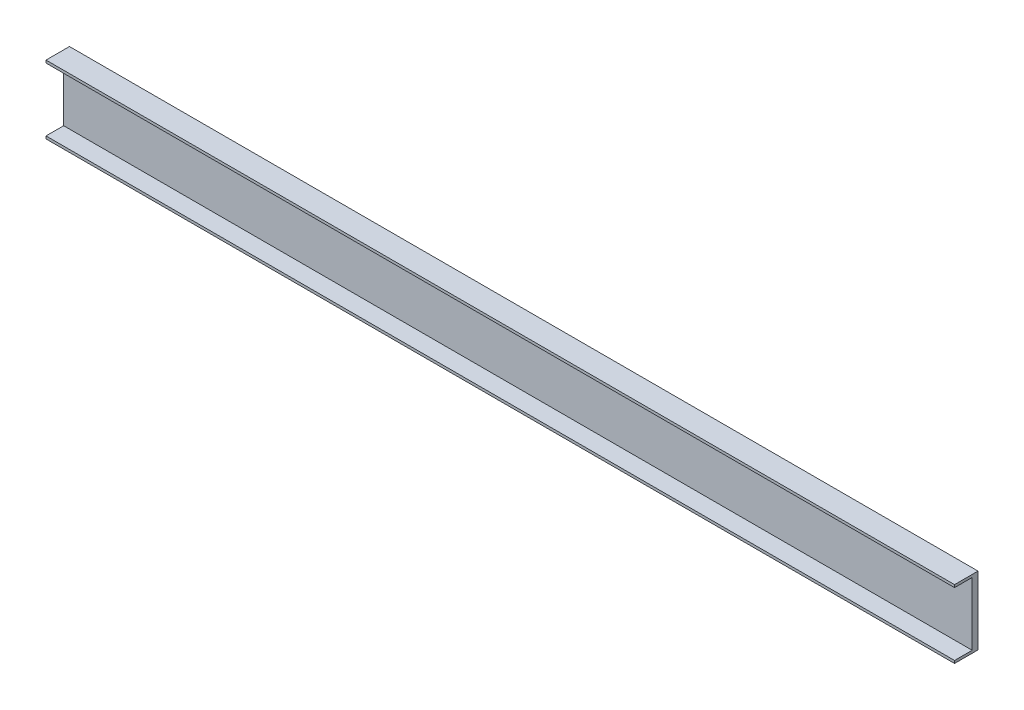
ISO-10303-21;
HEADER;
FILE_DESCRIPTION(('STEP AP214'),'2;1');
FILE_NAME('part.step','',(''),(''),'','','');
FILE_SCHEMA(('AUTOMOTIVE_DESIGN { 1 0 10303 214 1 1 1 1 }'));
ENDSEC;
DATA;
#1=APPLICATION_CONTEXT('core data for automotive mechanical design processes');
#2=APPLICATION_PROTOCOL_DEFINITION('international standard','automotive_design',2000,#1);
#3=PRODUCT_CONTEXT('',#1,'mechanical');
#4=PRODUCT('Part','Part','',(#3));
#5=PRODUCT_RELATED_PRODUCT_CATEGORY('part','',(#4));
#6=PRODUCT_DEFINITION_FORMATION('','',#4);
#7=PRODUCT_DEFINITION_CONTEXT('part definition',#1,'design');
#8=PRODUCT_DEFINITION('design','',#6,#7);
#9=PRODUCT_DEFINITION_SHAPE('','',#8);
#10=(LENGTH_UNIT() NAMED_UNIT(*) SI_UNIT(.MILLI.,.METRE.));
#11=(NAMED_UNIT(*) PLANE_ANGLE_UNIT() SI_UNIT($,.RADIAN.));
#12=(NAMED_UNIT(*) SI_UNIT($,.STERADIAN.) SOLID_ANGLE_UNIT());
#13=UNCERTAINTY_MEASURE_WITH_UNIT(LENGTH_MEASURE(1.E-05),#10,'distance_accuracy_value','');
#14=(GEOMETRIC_REPRESENTATION_CONTEXT(3) GLOBAL_UNCERTAINTY_ASSIGNED_CONTEXT((#13)) GLOBAL_UNIT_ASSIGNED_CONTEXT((#10,
#11,#12)) REPRESENTATION_CONTEXT('',''));
#15=CARTESIAN_POINT('',(0.,0.,0.));
#16=DIRECTION('',(0.,0.,1.));
#17=DIRECTION('',(1.,0.,0.));
#18=AXIS2_PLACEMENT_3D('',#15,#16,#17);
#19=CARTESIAN_POINT('',(-1995.,-150.,0.));
#20=DIRECTION('',(0.,0.,1.));
#21=DIRECTION('',(1.,0.,0.));
#22=AXIS2_PLACEMENT_3D('',#19,#20,#21);
#23=PLANE('',#22);
#24=DIRECTION('',(0.,1.,0.));
#25=VECTOR('',#24,1.);
#26=CARTESIAN_POINT('',(865.,115.,0.));
#27=LINE('',#26,#25);
#28=CARTESIAN_POINT('',(865.,-115.,0.));
#29=VERTEX_POINT('',#28);
#30=CARTESIAN_POINT('',(865.,115.,0.));
#31=VERTEX_POINT('',#30);
#32=EDGE_CURVE('E265',#29,#31,#27,.T.);
#33=ORIENTED_EDGE('',*,*,#32,.F.);
#34=DIRECTION('',(-1.,0.,0.));
#35=VECTOR('',#34,1.);
#36=CARTESIAN_POINT('',(865.,-115.,0.));
#37=LINE('',#36,#35);
#38=CARTESIAN_POINT('',(935.,-115.,0.));
#39=VERTEX_POINT('',#38);
#40=EDGE_CURVE('E278',#39,#29,#37,.T.);
#41=ORIENTED_EDGE('',*,*,#40,.F.);
#42=DIRECTION('',(0.,-1.,0.));
#43=VECTOR('',#42,1.);
#44=CARTESIAN_POINT('',(935.,115.,0.));
#45=LINE('',#44,#43);
#46=CARTESIAN_POINT('',(935.,115.,0.));
#47=VERTEX_POINT('',#46);
#48=EDGE_CURVE('E287',#47,#39,#45,.T.);
#49=ORIENTED_EDGE('',*,*,#48,.F.);
#50=DIRECTION('',(1.,0.,0.));
#51=VECTOR('',#50,1.);
#52=CARTESIAN_POINT('',(865.,115.,0.));
#53=LINE('',#52,#51);
#54=EDGE_CURVE('E268',#31,#47,#53,.T.);
#55=ORIENTED_EDGE('',*,*,#54,.F.);
#56=EDGE_LOOP('',(#33,#41,#49,#55));
#57=FACE_BOUND('',#56,.T.);
#58=DIRECTION('',(0.,1.,0.));
#59=VECTOR('',#58,1.);
#60=CARTESIAN_POINT('',(-535.,-115.,0.));
#61=LINE('',#60,#59);
#62=CARTESIAN_POINT('',(-535.,-115.,0.));
#63=VERTEX_POINT('',#62);
#64=CARTESIAN_POINT('',(-535.,115.,0.));
#65=VERTEX_POINT('',#64);
#66=EDGE_CURVE('E336',#63,#65,#61,.T.);
#67=ORIENTED_EDGE('',*,*,#66,.F.);
#68=DIRECTION('',(-1.,0.,0.));
#69=VECTOR('',#68,1.);
#70=CARTESIAN_POINT('',(-535.,-115.,0.));
#71=LINE('',#70,#69);
#72=CARTESIAN_POINT('',(-465.,-115.,0.));
#73=VERTEX_POINT('',#72);
#74=EDGE_CURVE('E341',#73,#63,#71,.T.);
#75=ORIENTED_EDGE('',*,*,#74,.F.);
#76=DIRECTION('',(0.,-1.,0.));
#77=VECTOR('',#76,1.);
#78=CARTESIAN_POINT('',(-465.,-115.,0.));
#79=LINE('',#78,#77);
#80=CARTESIAN_POINT('',(-465.,115.,0.));
#81=VERTEX_POINT('',#80);
#82=EDGE_CURVE('E353',#81,#73,#79,.T.);
#83=ORIENTED_EDGE('',*,*,#82,.F.);
#84=DIRECTION('',(1.,0.,0.));
#85=VECTOR('',#84,1.);
#86=CARTESIAN_POINT('',(-535.,115.,0.));
#87=LINE('',#86,#85);
#88=EDGE_CURVE('E350',#65,#81,#87,.T.);
#89=ORIENTED_EDGE('',*,*,#88,.F.);
#90=EDGE_LOOP('',(#67,#75,#83,#89));
#91=FACE_BOUND('',#90,.T.);
#92=DIRECTION('',(0.,-1.,0.));
#93=VECTOR('',#92,1.);
#94=CARTESIAN_POINT('',(-1265.,115.,0.));
#95=LINE('',#94,#93);
#96=CARTESIAN_POINT('',(-1265.,115.,0.));
#97=VERTEX_POINT('',#96);
#98=CARTESIAN_POINT('',(-1265.,-115.,0.));
#99=VERTEX_POINT('',#98);
#100=EDGE_CURVE('E402',#97,#99,#95,.T.);
#101=ORIENTED_EDGE('',*,*,#100,.F.);
#102=DIRECTION('',(1.,0.,0.));
#103=VECTOR('',#102,1.);
#104=CARTESIAN_POINT('',(-1265.,115.,0.));
#105=LINE('',#104,#103);
#106=CARTESIAN_POINT('',(-1335.,115.,0.));
#107=VERTEX_POINT('',#106);
#108=EDGE_CURVE('E407',#107,#97,#105,.T.);
#109=ORIENTED_EDGE('',*,*,#108,.F.);
#110=DIRECTION('',(0.,1.,0.));
#111=VECTOR('',#110,1.);
#112=CARTESIAN_POINT('',(-1335.,115.,0.));
#113=LINE('',#112,#111);
#114=CARTESIAN_POINT('',(-1335.,-115.,0.));
#115=VERTEX_POINT('',#114);
#116=EDGE_CURVE('E419',#115,#107,#113,.T.);
#117=ORIENTED_EDGE('',*,*,#116,.F.);
#118=DIRECTION('',(-1.,0.,0.));
#119=VECTOR('',#118,1.);
#120=CARTESIAN_POINT('',(-1265.,-115.,0.));
#121=LINE('',#120,#119);
#122=EDGE_CURVE('E416',#99,#115,#121,.T.);
#123=ORIENTED_EDGE('',*,*,#122,.F.);
#124=EDGE_LOOP('',(#101,#109,#117,#123));
#125=FACE_BOUND('',#124,.T.);
#126=DIRECTION('',(0.,-1.,0.));
#127=VECTOR('',#126,1.);
#128=CARTESIAN_POINT('',(-1995.,150.,0.));
#129=LINE('',#128,#127);
#130=CARTESIAN_POINT('',(-1995.,150.,0.));
#131=VERTEX_POINT('',#130);
#132=CARTESIAN_POINT('',(-1995.,-150.,0.));
#133=VERTEX_POINT('',#132);
#134=EDGE_CURVE('E481',#131,#133,#129,.T.);
#135=ORIENTED_EDGE('',*,*,#134,.F.);
#136=DIRECTION('',(-1.,0.,0.));
#137=VECTOR('',#136,1.);
#138=CARTESIAN_POINT('',(-1995.,150.,0.));
#139=LINE('',#138,#137);
#140=CARTESIAN_POINT('',(1995.,150.,0.));
#141=VERTEX_POINT('',#140);
#142=EDGE_CURVE('E496',#141,#131,#139,.T.);
#143=ORIENTED_EDGE('',*,*,#142,.F.);
#144=DIRECTION('',(0.,1.,0.));
#145=VECTOR('',#144,1.);
#146=CARTESIAN_POINT('',(1995.,150.,0.));
#147=LINE('',#146,#145);
#148=CARTESIAN_POINT('',(1995.,-150.,0.));
#149=VERTEX_POINT('',#148);
#150=EDGE_CURVE('E491',#149,#141,#147,.T.);
#151=ORIENTED_EDGE('',*,*,#150,.F.);
#152=DIRECTION('',(1.,0.,0.));
#153=VECTOR('',#152,1.);
#154=CARTESIAN_POINT('',(-1995.,-150.,0.));
#155=LINE('',#154,#153);
#156=EDGE_CURVE('E486',#133,#149,#155,.T.);
#157=ORIENTED_EDGE('',*,*,#156,.F.);
#158=EDGE_LOOP('',(#135,#143,#151,#157));
#159=FACE_BOUND('',#158,.T.);
#160=DIRECTION('',(0.,-1.,0.));
#161=VECTOR('',#160,1.);
#162=CARTESIAN_POINT('',(-865.,115.,0.));
#163=LINE('',#162,#161);
#164=CARTESIAN_POINT('',(-865.,115.,0.));
#165=VERTEX_POINT('',#164);
#166=CARTESIAN_POINT('',(-865.,-115.,0.));
#167=VERTEX_POINT('',#166);
#168=EDGE_CURVE('E369',#165,#167,#163,.T.);
#169=ORIENTED_EDGE('',*,*,#168,.F.);
#170=DIRECTION('',(1.,0.,0.));
#171=VECTOR('',#170,1.);
#172=CARTESIAN_POINT('',(-865.,115.,0.));
#173=LINE('',#172,#171);
#174=CARTESIAN_POINT('',(-935.,115.,0.));
#175=VERTEX_POINT('',#174);
#176=EDGE_CURVE('E374',#175,#165,#173,.T.);
#177=ORIENTED_EDGE('',*,*,#176,.F.);
#178=DIRECTION('',(0.,1.,0.));
#179=VECTOR('',#178,1.);
#180=CARTESIAN_POINT('',(-935.,115.,0.));
#181=LINE('',#180,#179);
#182=CARTESIAN_POINT('',(-935.,-115.,0.));
#183=VERTEX_POINT('',#182);
#184=EDGE_CURVE('E386',#183,#175,#181,.T.);
#185=ORIENTED_EDGE('',*,*,#184,.F.);
#186=DIRECTION('',(-1.,0.,0.));
#187=VECTOR('',#186,1.);
#188=CARTESIAN_POINT('',(-865.,-115.,0.));
#189=LINE('',#188,#187);
#190=EDGE_CURVE('E383',#167,#183,#189,.T.);
#191=ORIENTED_EDGE('',*,*,#190,.F.);
#192=EDGE_LOOP('',(#169,#177,#185,#191));
#193=FACE_BOUND('',#192,.T.);
#194=DIRECTION('',(0.,1.,0.));
#195=VECTOR('',#194,1.);
#196=CARTESIAN_POINT('',(1265.,115.,0.));
#197=LINE('',#196,#195);
#198=CARTESIAN_POINT('',(1265.,-115.,0.));
#199=VERTEX_POINT('',#198);
#200=CARTESIAN_POINT('',(1265.,115.,0.));
#201=VERTEX_POINT('',#200);
#202=EDGE_CURVE('E303',#199,#201,#197,.T.);
#203=ORIENTED_EDGE('',*,*,#202,.F.);
#204=DIRECTION('',(-1.,0.,0.));
#205=VECTOR('',#204,1.);
#206=CARTESIAN_POINT('',(1265.,-115.,0.));
#207=LINE('',#206,#205);
#208=CARTESIAN_POINT('',(1335.,-115.,0.));
#209=VERTEX_POINT('',#208);
#210=EDGE_CURVE('E308',#209,#199,#207,.T.);
#211=ORIENTED_EDGE('',*,*,#210,.F.);
#212=DIRECTION('',(0.,-1.,0.));
#213=VECTOR('',#212,1.);
#214=CARTESIAN_POINT('',(1335.,115.,0.));
#215=LINE('',#214,#213);
#216=CARTESIAN_POINT('',(1335.,115.,0.));
#217=VERTEX_POINT('',#216);
#218=EDGE_CURVE('E320',#217,#209,#215,.T.);
#219=ORIENTED_EDGE('',*,*,#218,.F.);
#220=DIRECTION('',(1.,0.,0.));
#221=VECTOR('',#220,1.);
#222=CARTESIAN_POINT('',(1265.,115.,0.));
#223=LINE('',#222,#221);
#224=EDGE_CURVE('E317',#201,#217,#223,.T.);
#225=ORIENTED_EDGE('',*,*,#224,.F.);
#226=EDGE_LOOP('',(#203,#211,#219,#225));
#227=FACE_BOUND('',#226,.T.);
#228=DIRECTION('',(-1.,0.,0.));
#229=VECTOR('',#228,1.);
#230=CARTESIAN_POINT('',(535.,-115.,0.));
#231=LINE('',#230,#229);
#232=CARTESIAN_POINT('',(535.,-115.,0.));
#233=VERTEX_POINT('',#232);
#234=CARTESIAN_POINT('',(465.,-115.,0.));
#235=VERTEX_POINT('',#234);
#236=EDGE_CURVE('E264',#233,#235,#231,.T.);
#237=ORIENTED_EDGE('',*,*,#236,.F.);
#238=DIRECTION('',(0.,-1.,0.));
#239=VECTOR('',#238,1.);
#240=CARTESIAN_POINT('',(535.,-115.,0.));
#241=LINE('',#240,#239);
#242=CARTESIAN_POINT('',(535.,115.,0.));
#243=VERTEX_POINT('',#242);
#244=EDGE_CURVE('E261',#243,#233,#241,.T.);
#245=ORIENTED_EDGE('',*,*,#244,.F.);
#246=DIRECTION('',(1.,0.,0.));
#247=VECTOR('',#246,1.);
#248=CARTESIAN_POINT('',(535.,115.,0.));
#249=LINE('',#248,#247);
#250=CARTESIAN_POINT('',(465.,115.,0.));
#251=VERTEX_POINT('',#250);
#252=EDGE_CURVE('E55',#251,#243,#249,.T.);
#253=ORIENTED_EDGE('',*,*,#252,.F.);
#254=DIRECTION('',(0.,1.,0.));
#255=VECTOR('',#254,1.);
#256=CARTESIAN_POINT('',(465.,-115.,0.));
#257=LINE('',#256,#255);
#258=EDGE_CURVE('E50',#235,#251,#257,.T.);
#259=ORIENTED_EDGE('',*,*,#258,.F.);
#260=EDGE_LOOP('',(#237,#245,#253,#259));
#261=FACE_BOUND('',#260,.T.);
#262=ADVANCED_FACE('F32',(#57,#91,#125,#159,#193,#227,#261),#23,.F.);
#263=CARTESIAN_POINT('',(-1995.,-150.,25.5));
#264=DIRECTION('',(0.,0.,1.));
#265=DIRECTION('',(1.,0.,0.));
#266=AXIS2_PLACEMENT_3D('',#263,#264,#265);
#267=PLANE('',#266);
#268=DIRECTION('',(0.,-1.,0.));
#269=VECTOR('',#268,1.);
#270=CARTESIAN_POINT('',(-1995.,150.,25.5));
#271=LINE('',#270,#269);
#272=CARTESIAN_POINT('',(-1995.,138.5,25.5));
#273=VERTEX_POINT('',#272);
#274=CARTESIAN_POINT('',(-1995.,-138.5,25.5));
#275=VERTEX_POINT('',#274);
#276=EDGE_CURVE('E474',#273,#275,#271,.T.);
#277=ORIENTED_EDGE('',*,*,#276,.T.);
#278=DIRECTION('',(-1.,0.,0.));
#279=VECTOR('',#278,1.);
#280=CARTESIAN_POINT('',(-1995.,-138.5,25.5));
#281=LINE('',#280,#279);
#282=CARTESIAN_POINT('',(1995.,-138.5,25.5));
#283=VERTEX_POINT('',#282);
#284=EDGE_CURVE('E435',#283,#275,#281,.T.);
#285=ORIENTED_EDGE('',*,*,#284,.F.);
#286=DIRECTION('',(0.,1.,0.));
#287=VECTOR('',#286,1.);
#288=CARTESIAN_POINT('',(1995.,150.,25.5));
#289=LINE('',#288,#287);
#290=CARTESIAN_POINT('',(1995.,138.5,25.5));
#291=VERTEX_POINT('',#290);
#292=EDGE_CURVE('E36',#283,#291,#289,.T.);
#293=ORIENTED_EDGE('',*,*,#292,.T.);
#294=DIRECTION('',(1.,0.,0.));
#295=VECTOR('',#294,1.);
#296=CARTESIAN_POINT('',(-1995.,138.5,25.5));
#297=LINE('',#296,#295);
#298=EDGE_CURVE('E454',#273,#291,#297,.T.);
#299=ORIENTED_EDGE('',*,*,#298,.F.);
#300=EDGE_LOOP('',(#277,#285,#293,#299));
#301=FACE_BOUND('',#300,.T.);
#302=ADVANCED_FACE('F526',(#301),#267,.T.);
#303=CARTESIAN_POINT('',(-1995.,150.,25.5));
#304=DIRECTION('',(1.,0.,0.));
#305=DIRECTION('',(0.,0.,-1.));
#306=AXIS2_PLACEMENT_3D('',#303,#304,#305);
#307=PLANE('',#306);
#308=ORIENTED_EDGE('',*,*,#134,.T.);
#309=DIRECTION('',(0.,0.,-1.));
#310=VECTOR('',#309,1.);
#311=CARTESIAN_POINT('',(-1995.,-150.,25.5));
#312=LINE('',#311,#310);
#313=CARTESIAN_POINT('',(-1995.,-150.,103.));
#314=VERTEX_POINT('',#313);
#315=EDGE_CURVE('E11',#314,#133,#312,.T.);
#316=ORIENTED_EDGE('',*,*,#315,.F.);
#317=DIRECTION('',(0.,-1.,0.));
#318=VECTOR('',#317,1.);
#319=CARTESIAN_POINT('',(-1995.,-150.,103.));
#320=LINE('',#319,#318);
#321=CARTESIAN_POINT('',(-1995.,-138.5,103.));
#322=VERTEX_POINT('',#321);
#323=EDGE_CURVE('E443',#322,#314,#320,.T.);
#324=ORIENTED_EDGE('',*,*,#323,.F.);
#325=DIRECTION('',(0.,0.,-1.));
#326=VECTOR('',#325,1.);
#327=CARTESIAN_POINT('',(-1995.,-138.5,103.));
#328=LINE('',#327,#326);
#329=EDGE_CURVE('E446',#322,#275,#328,.T.);
#330=ORIENTED_EDGE('',*,*,#329,.T.);
#331=ORIENTED_EDGE('',*,*,#276,.F.);
#332=DIRECTION('',(0.,0.,-1.));
#333=VECTOR('',#332,1.);
#334=CARTESIAN_POINT('',(-1995.,138.5,103.));
#335=LINE('',#334,#333);
#336=CARTESIAN_POINT('',(-1995.,138.5,103.));
#337=VERTEX_POINT('',#336);
#338=EDGE_CURVE('E477',#337,#273,#335,.T.);
#339=ORIENTED_EDGE('',*,*,#338,.F.);
#340=DIRECTION('',(0.,-1.,0.));
#341=VECTOR('',#340,1.);
#342=CARTESIAN_POINT('',(-1995.,150.,103.));
#343=LINE('',#342,#341);
#344=CARTESIAN_POINT('',(-1995.,150.,103.));
#345=VERTEX_POINT('',#344);
#346=EDGE_CURVE('E455',#345,#337,#343,.T.);
#347=ORIENTED_EDGE('',*,*,#346,.F.);
#348=DIRECTION('',(0.,0.,-1.));
#349=VECTOR('',#348,1.);
#350=CARTESIAN_POINT('',(-1995.,150.,25.5));
#351=LINE('',#350,#349);
#352=EDGE_CURVE('E498',#345,#131,#351,.T.);
#353=ORIENTED_EDGE('',*,*,#352,.T.);
#354=EDGE_LOOP('',(#308,#316,#324,#330,#331,#339,#347,#353));
#355=FACE_BOUND('',#354,.T.);
#356=ADVANCED_FACE('F34',(#355),#307,.F.);
#357=CARTESIAN_POINT('',(-1995.,-150.,25.5));
#358=DIRECTION('',(0.,1.,0.));
#359=DIRECTION('',(-1.,0.,0.));
#360=AXIS2_PLACEMENT_3D('',#357,#358,#359);
#361=PLANE('',#360);
#362=ORIENTED_EDGE('',*,*,#156,.T.);
#363=DIRECTION('',(0.,0.,-1.));
#364=VECTOR('',#363,1.);
#365=CARTESIAN_POINT('',(1995.,-150.,25.5));
#366=LINE('',#365,#364);
#367=CARTESIAN_POINT('',(1995.,-150.,103.));
#368=VERTEX_POINT('',#367);
#369=EDGE_CURVE('E42',#368,#149,#366,.T.);
#370=ORIENTED_EDGE('',*,*,#369,.F.);
#371=DIRECTION('',(1.,0.,0.));
#372=VECTOR('',#371,1.);
#373=CARTESIAN_POINT('',(-1995.,-150.,103.));
#374=LINE('',#373,#372);
#375=EDGE_CURVE('E436',#314,#368,#374,.T.);
#376=ORIENTED_EDGE('',*,*,#375,.F.);
#377=ORIENTED_EDGE('',*,*,#315,.T.);
#378=EDGE_LOOP('',(#362,#370,#376,#377));
#379=FACE_BOUND('',#378,.T.);
#380=ADVANCED_FACE('F534',(#379),#361,.F.);
#381=CARTESIAN_POINT('',(1995.,150.,25.5));
#382=DIRECTION('',(-1.,0.,0.));
#383=DIRECTION('',(0.,0.,1.));
#384=AXIS2_PLACEMENT_3D('',#381,#382,#383);
#385=PLANE('',#384);
#386=ORIENTED_EDGE('',*,*,#150,.T.);
#387=DIRECTION('',(0.,0.,-1.));
#388=VECTOR('',#387,1.);
#389=CARTESIAN_POINT('',(1995.,150.,25.5));
#390=LINE('',#389,#388);
#391=CARTESIAN_POINT('',(1995.,150.,103.));
#392=VERTEX_POINT('',#391);
#393=EDGE_CURVE('E500',#392,#141,#390,.T.);
#394=ORIENTED_EDGE('',*,*,#393,.F.);
#395=DIRECTION('',(0.,1.,0.));
#396=VECTOR('',#395,1.);
#397=CARTESIAN_POINT('',(1995.,150.,103.));
#398=LINE('',#397,#396);
#399=CARTESIAN_POINT('',(1995.,138.5,103.));
#400=VERTEX_POINT('',#399);
#401=EDGE_CURVE('E460',#400,#392,#398,.T.);
#402=ORIENTED_EDGE('',*,*,#401,.F.);
#403=DIRECTION('',(0.,0.,-1.));
#404=VECTOR('',#403,1.);
#405=CARTESIAN_POINT('',(1995.,138.5,103.));
#406=LINE('',#405,#404);
#407=EDGE_CURVE('E466',#400,#291,#406,.T.);
#408=ORIENTED_EDGE('',*,*,#407,.T.);
#409=ORIENTED_EDGE('',*,*,#292,.F.);
#410=DIRECTION('',(0.,0.,-1.));
#411=VECTOR('',#410,1.);
#412=CARTESIAN_POINT('',(1995.,-138.5,103.));
#413=LINE('',#412,#411);
#414=CARTESIAN_POINT('',(1995.,-138.5,103.));
#415=VERTEX_POINT('',#414);
#416=EDGE_CURVE('E451',#415,#283,#413,.T.);
#417=ORIENTED_EDGE('',*,*,#416,.F.);
#418=DIRECTION('',(0.,1.,0.));
#419=VECTOR('',#418,1.);
#420=CARTESIAN_POINT('',(1995.,-150.,103.));
#421=LINE('',#420,#419);
#422=EDGE_CURVE('E439',#368,#415,#421,.T.);
#423=ORIENTED_EDGE('',*,*,#422,.F.);
#424=ORIENTED_EDGE('',*,*,#369,.T.);
#425=EDGE_LOOP('',(#386,#394,#402,#408,#409,#417,#423,#424));
#426=FACE_BOUND('',#425,.T.);
#427=ADVANCED_FACE('F507',(#426),#385,.F.);
#428=CARTESIAN_POINT('',(-1995.,150.,25.5));
#429=DIRECTION('',(0.,-1.,0.));
#430=DIRECTION('',(1.,0.,0.));
#431=AXIS2_PLACEMENT_3D('',#428,#429,#430);
#432=PLANE('',#431);
#433=ORIENTED_EDGE('',*,*,#142,.T.);
#434=ORIENTED_EDGE('',*,*,#352,.F.);
#435=DIRECTION('',(-1.,0.,0.));
#436=VECTOR('',#435,1.);
#437=CARTESIAN_POINT('',(-1995.,150.,103.));
#438=LINE('',#437,#436);
#439=EDGE_CURVE('E463',#392,#345,#438,.T.);
#440=ORIENTED_EDGE('',*,*,#439,.F.);
#441=ORIENTED_EDGE('',*,*,#393,.T.);
#442=EDGE_LOOP('',(#433,#434,#440,#441));
#443=FACE_BOUND('',#442,.T.);
#444=ADVANCED_FACE('F515',(#443),#432,.F.);
#445=CARTESIAN_POINT('',(-1995.,138.5,103.));
#446=DIRECTION('',(0.,1.,0.));
#447=DIRECTION('',(0.,0.,1.));
#448=AXIS2_PLACEMENT_3D('',#445,#446,#447);
#449=PLANE('',#448);
#450=ORIENTED_EDGE('',*,*,#298,.T.);
#451=ORIENTED_EDGE('',*,*,#407,.F.);
#452=DIRECTION('',(1.,0.,0.));
#453=VECTOR('',#452,1.);
#454=CARTESIAN_POINT('',(-1995.,138.5,103.));
#455=LINE('',#454,#453);
#456=EDGE_CURVE('E458',#337,#400,#455,.T.);
#457=ORIENTED_EDGE('',*,*,#456,.F.);
#458=ORIENTED_EDGE('',*,*,#338,.T.);
#459=EDGE_LOOP('',(#450,#451,#457,#458));
#460=FACE_BOUND('',#459,.T.);
#461=ADVANCED_FACE('F524',(#460),#449,.F.);
#462=CARTESIAN_POINT('',(-1995.,138.5,103.));
#463=DIRECTION('',(0.,0.,1.));
#464=DIRECTION('',(1.,0.,0.));
#465=AXIS2_PLACEMENT_3D('',#462,#463,#464);
#466=PLANE('',#465);
#467=ORIENTED_EDGE('',*,*,#346,.T.);
#468=ORIENTED_EDGE('',*,*,#456,.T.);
#469=ORIENTED_EDGE('',*,*,#401,.T.);
#470=ORIENTED_EDGE('',*,*,#439,.T.);
#471=EDGE_LOOP('',(#467,#468,#469,#470));
#472=FACE_BOUND('',#471,.T.);
#473=ADVANCED_FACE('F520',(#472),#466,.T.);
#474=CARTESIAN_POINT('',(-1995.,-138.5,103.));
#475=DIRECTION('',(0.,-1.,0.));
#476=DIRECTION('',(0.,0.,-1.));
#477=AXIS2_PLACEMENT_3D('',#474,#475,#476);
#478=PLANE('',#477);
#479=ORIENTED_EDGE('',*,*,#284,.T.);
#480=ORIENTED_EDGE('',*,*,#329,.F.);
#481=DIRECTION('',(-1.,0.,0.));
#482=VECTOR('',#481,1.);
#483=CARTESIAN_POINT('',(-1995.,-138.5,103.));
#484=LINE('',#483,#482);
#485=EDGE_CURVE('E441',#415,#322,#484,.T.);
#486=ORIENTED_EDGE('',*,*,#485,.F.);
#487=ORIENTED_EDGE('',*,*,#416,.T.);
#488=EDGE_LOOP('',(#479,#480,#486,#487));
#489=FACE_BOUND('',#488,.T.);
#490=ADVANCED_FACE('F531',(#489),#478,.F.);
#491=CARTESIAN_POINT('',(1995.,-150.,103.));
#492=DIRECTION('',(0.,0.,1.));
#493=DIRECTION('',(1.,0.,0.));
#494=AXIS2_PLACEMENT_3D('',#491,#492,#493);
#495=PLANE('',#494);
#496=ORIENTED_EDGE('',*,*,#375,.T.);
#497=ORIENTED_EDGE('',*,*,#422,.T.);
#498=ORIENTED_EDGE('',*,*,#485,.T.);
#499=ORIENTED_EDGE('',*,*,#323,.T.);
#500=EDGE_LOOP('',(#496,#497,#498,#499));
#501=FACE_BOUND('',#500,.T.);
#502=ADVANCED_FACE('F533',(#501),#495,.T.);
#503=CARTESIAN_POINT('',(-1265.,115.,-16.));
#504=DIRECTION('',(-1.,0.,0.));
#505=DIRECTION('',(0.,0.,1.));
#506=AXIS2_PLACEMENT_3D('',#503,#504,#505);
#507=PLANE('',#506);
#508=ORIENTED_EDGE('',*,*,#100,.T.);
#509=DIRECTION('',(0.,0.,1.));
#510=VECTOR('',#509,1.);
#511=CARTESIAN_POINT('',(-1265.,-115.,-16.));
#512=LINE('',#511,#510);
#513=CARTESIAN_POINT('',(-1265.,-115.,-16.));
#514=VERTEX_POINT('',#513);
#515=EDGE_CURVE('E432',#514,#99,#512,.T.);
#516=ORIENTED_EDGE('',*,*,#515,.F.);
#517=DIRECTION('',(0.,-1.,0.));
#518=VECTOR('',#517,1.);
#519=CARTESIAN_POINT('',(-1265.,115.,-16.));
#520=LINE('',#519,#518);
#521=CARTESIAN_POINT('',(-1265.,115.,-16.));
#522=VERTEX_POINT('',#521);
#523=EDGE_CURVE('E403',#522,#514,#520,.T.);
#524=ORIENTED_EDGE('',*,*,#523,.F.);
#525=DIRECTION('',(0.,0.,1.));
#526=VECTOR('',#525,1.);
#527=CARTESIAN_POINT('',(-1265.,115.,-16.));
#528=LINE('',#527,#526);
#529=EDGE_CURVE('E413',#522,#97,#528,.T.);
#530=ORIENTED_EDGE('',*,*,#529,.T.);
#531=EDGE_LOOP('',(#508,#516,#524,#530));
#532=FACE_BOUND('',#531,.T.);
#533=ADVANCED_FACE('F564',(#532),#507,.F.);
#534=CARTESIAN_POINT('',(-1265.,-115.,-16.));
#535=DIRECTION('',(0.,1.,0.));
#536=DIRECTION('',(-1.,0.,0.));
#537=AXIS2_PLACEMENT_3D('',#534,#535,#536);
#538=PLANE('',#537);
#539=ORIENTED_EDGE('',*,*,#122,.T.);
#540=DIRECTION('',(0.,0.,1.));
#541=VECTOR('',#540,1.);
#542=CARTESIAN_POINT('',(-1335.,-115.,-16.));
#543=LINE('',#542,#541);
#544=CARTESIAN_POINT('',(-1335.,-115.,-16.));
#545=VERTEX_POINT('',#544);
#546=EDGE_CURVE('E429',#545,#115,#543,.T.);
#547=ORIENTED_EDGE('',*,*,#546,.F.);
#548=DIRECTION('',(-1.,0.,0.));
#549=VECTOR('',#548,1.);
#550=CARTESIAN_POINT('',(-1265.,-115.,-16.));
#551=LINE('',#550,#549);
#552=EDGE_CURVE('E406',#514,#545,#551,.T.);
#553=ORIENTED_EDGE('',*,*,#552,.F.);
#554=ORIENTED_EDGE('',*,*,#515,.T.);
#555=EDGE_LOOP('',(#539,#547,#553,#554));
#556=FACE_BOUND('',#555,.T.);
#557=ADVANCED_FACE('F567',(#556),#538,.F.);
#558=CARTESIAN_POINT('',(-1335.,115.,-16.));
#559=DIRECTION('',(1.,0.,0.));
#560=DIRECTION('',(0.,1.,0.));
#561=AXIS2_PLACEMENT_3D('',#558,#559,#560);
#562=PLANE('',#561);
#563=ORIENTED_EDGE('',*,*,#116,.T.);
#564=DIRECTION('',(0.,0.,1.));
#565=VECTOR('',#564,1.);
#566=CARTESIAN_POINT('',(-1335.,115.,-16.));
#567=LINE('',#566,#565);
#568=CARTESIAN_POINT('',(-1335.,115.,-16.));
#569=VERTEX_POINT('',#568);
#570=EDGE_CURVE('E426',#569,#107,#567,.T.);
#571=ORIENTED_EDGE('',*,*,#570,.F.);
#572=DIRECTION('',(0.,1.,0.));
#573=VECTOR('',#572,1.);
#574=CARTESIAN_POINT('',(-1335.,115.,-16.));
#575=LINE('',#574,#573);
#576=EDGE_CURVE('E409',#545,#569,#575,.T.);
#577=ORIENTED_EDGE('',*,*,#576,.F.);
#578=ORIENTED_EDGE('',*,*,#546,.T.);
#579=EDGE_LOOP('',(#563,#571,#577,#578));
#580=FACE_BOUND('',#579,.T.);
#581=ADVANCED_FACE('F571',(#580),#562,.F.);
#582=CARTESIAN_POINT('',(-1265.,115.,-16.));
#583=DIRECTION('',(0.,-1.,0.));
#584=DIRECTION('',(1.,0.,0.));
#585=AXIS2_PLACEMENT_3D('',#582,#583,#584);
#586=PLANE('',#585);
#587=ORIENTED_EDGE('',*,*,#108,.T.);
#588=ORIENTED_EDGE('',*,*,#529,.F.);
#589=DIRECTION('',(1.,0.,0.));
#590=VECTOR('',#589,1.);
#591=CARTESIAN_POINT('',(-1265.,115.,-16.));
#592=LINE('',#591,#590);
#593=EDGE_CURVE('E411',#569,#522,#592,.T.);
#594=ORIENTED_EDGE('',*,*,#593,.F.);
#595=ORIENTED_EDGE('',*,*,#570,.T.);
#596=EDGE_LOOP('',(#587,#588,#594,#595));
#597=FACE_BOUND('',#596,.T.);
#598=ADVANCED_FACE('F575',(#597),#586,.F.);
#599=CARTESIAN_POINT('',(-1265.,115.,-16.));
#600=DIRECTION('',(0.,0.,-1.));
#601=DIRECTION('',(-1.,0.,0.));
#602=AXIS2_PLACEMENT_3D('',#599,#600,#601);
#603=PLANE('',#602);
#604=ORIENTED_EDGE('',*,*,#523,.T.);
#605=ORIENTED_EDGE('',*,*,#552,.T.);
#606=ORIENTED_EDGE('',*,*,#576,.T.);
#607=ORIENTED_EDGE('',*,*,#593,.T.);
#608=EDGE_LOOP('',(#604,#605,#606,#607));
#609=FACE_BOUND('',#608,.T.);
#610=ADVANCED_FACE('F579',(#609),#603,.T.);
#611=CARTESIAN_POINT('',(-865.,115.,-16.));
#612=DIRECTION('',(-1.,0.,0.));
#613=DIRECTION('',(0.,-1.,0.));
#614=AXIS2_PLACEMENT_3D('',#611,#612,#613);
#615=PLANE('',#614);
#616=ORIENTED_EDGE('',*,*,#168,.T.);
#617=DIRECTION('',(0.,0.,1.));
#618=VECTOR('',#617,1.);
#619=CARTESIAN_POINT('',(-865.,-115.,-16.));
#620=LINE('',#619,#618);
#621=CARTESIAN_POINT('',(-865.,-115.,-16.));
#622=VERTEX_POINT('',#621);
#623=EDGE_CURVE('E399',#622,#167,#620,.T.);
#624=ORIENTED_EDGE('',*,*,#623,.F.);
#625=DIRECTION('',(0.,-1.,0.));
#626=VECTOR('',#625,1.);
#627=CARTESIAN_POINT('',(-865.,115.,-16.));
#628=LINE('',#627,#626);
#629=CARTESIAN_POINT('',(-865.,115.,-16.));
#630=VERTEX_POINT('',#629);
#631=EDGE_CURVE('E370',#630,#622,#628,.T.);
#632=ORIENTED_EDGE('',*,*,#631,.F.);
#633=DIRECTION('',(0.,0.,1.));
#634=VECTOR('',#633,1.);
#635=CARTESIAN_POINT('',(-865.,115.,-16.));
#636=LINE('',#635,#634);
#637=EDGE_CURVE('E380',#630,#165,#636,.T.);
#638=ORIENTED_EDGE('',*,*,#637,.T.);
#639=EDGE_LOOP('',(#616,#624,#632,#638));
#640=FACE_BOUND('',#639,.T.);
#641=ADVANCED_FACE('F583',(#640),#615,.F.);
#642=CARTESIAN_POINT('',(-865.,-115.,-16.));
#643=DIRECTION('',(0.,1.,0.));
#644=DIRECTION('',(-1.,0.,0.));
#645=AXIS2_PLACEMENT_3D('',#642,#643,#644);
#646=PLANE('',#645);
#647=ORIENTED_EDGE('',*,*,#190,.T.);
#648=DIRECTION('',(0.,0.,1.));
#649=VECTOR('',#648,1.);
#650=CARTESIAN_POINT('',(-935.,-115.,-16.));
#651=LINE('',#650,#649);
#652=CARTESIAN_POINT('',(-935.,-115.,-16.));
#653=VERTEX_POINT('',#652);
#654=EDGE_CURVE('E396',#653,#183,#651,.T.);
#655=ORIENTED_EDGE('',*,*,#654,.F.);
#656=DIRECTION('',(-1.,0.,0.));
#657=VECTOR('',#656,1.);
#658=CARTESIAN_POINT('',(-865.,-115.,-16.));
#659=LINE('',#658,#657);
#660=EDGE_CURVE('E373',#622,#653,#659,.T.);
#661=ORIENTED_EDGE('',*,*,#660,.F.);
#662=ORIENTED_EDGE('',*,*,#623,.T.);
#663=EDGE_LOOP('',(#647,#655,#661,#662));
#664=FACE_BOUND('',#663,.T.);
#665=ADVANCED_FACE('F587',(#664),#646,.F.);
#666=CARTESIAN_POINT('',(-935.,115.,-16.));
#667=DIRECTION('',(1.,0.,0.));
#668=DIRECTION('',(0.,0.,-1.));
#669=AXIS2_PLACEMENT_3D('',#666,#667,#668);
#670=PLANE('',#669);
#671=ORIENTED_EDGE('',*,*,#184,.T.);
#672=DIRECTION('',(0.,0.,1.));
#673=VECTOR('',#672,1.);
#674=CARTESIAN_POINT('',(-935.,115.,-16.));
#675=LINE('',#674,#673);
#676=CARTESIAN_POINT('',(-935.,115.,-16.));
#677=VERTEX_POINT('',#676);
#678=EDGE_CURVE('E393',#677,#175,#675,.T.);
#679=ORIENTED_EDGE('',*,*,#678,.F.);
#680=DIRECTION('',(0.,1.,0.));
#681=VECTOR('',#680,1.);
#682=CARTESIAN_POINT('',(-935.,115.,-16.));
#683=LINE('',#682,#681);
#684=EDGE_CURVE('E376',#653,#677,#683,.T.);
#685=ORIENTED_EDGE('',*,*,#684,.F.);
#686=ORIENTED_EDGE('',*,*,#654,.T.);
#687=EDGE_LOOP('',(#671,#679,#685,#686));
#688=FACE_BOUND('',#687,.T.);
#689=ADVANCED_FACE('F591',(#688),#670,.F.);
#690=CARTESIAN_POINT('',(-865.,115.,-16.));
#691=DIRECTION('',(0.,-1.,0.));
#692=DIRECTION('',(1.,0.,0.));
#693=AXIS2_PLACEMENT_3D('',#690,#691,#692);
#694=PLANE('',#693);
#695=ORIENTED_EDGE('',*,*,#176,.T.);
#696=ORIENTED_EDGE('',*,*,#637,.F.);
#697=DIRECTION('',(1.,0.,0.));
#698=VECTOR('',#697,1.);
#699=CARTESIAN_POINT('',(-865.,115.,-16.));
#700=LINE('',#699,#698);
#701=EDGE_CURVE('E378',#677,#630,#700,.T.);
#702=ORIENTED_EDGE('',*,*,#701,.F.);
#703=ORIENTED_EDGE('',*,*,#678,.T.);
#704=EDGE_LOOP('',(#695,#696,#702,#703));
#705=FACE_BOUND('',#704,.T.);
#706=ADVANCED_FACE('F595',(#705),#694,.F.);
#707=CARTESIAN_POINT('',(-865.,115.,-16.));
#708=DIRECTION('',(0.,0.,-1.));
#709=DIRECTION('',(-1.,0.,0.));
#710=AXIS2_PLACEMENT_3D('',#707,#708,#709);
#711=PLANE('',#710);
#712=ORIENTED_EDGE('',*,*,#631,.T.);
#713=ORIENTED_EDGE('',*,*,#660,.T.);
#714=ORIENTED_EDGE('',*,*,#684,.T.);
#715=ORIENTED_EDGE('',*,*,#701,.T.);
#716=EDGE_LOOP('',(#712,#713,#714,#715));
#717=FACE_BOUND('',#716,.T.);
#718=ADVANCED_FACE('F599',(#717),#711,.T.);
#719=CARTESIAN_POINT('',(-535.,-115.,-16.));
#720=DIRECTION('',(1.,0.,0.));
#721=DIRECTION('',(0.,0.,-1.));
#722=AXIS2_PLACEMENT_3D('',#719,#720,#721);
#723=PLANE('',#722);
#724=ORIENTED_EDGE('',*,*,#66,.T.);
#725=DIRECTION('',(0.,0.,1.));
#726=VECTOR('',#725,1.);
#727=CARTESIAN_POINT('',(-535.,115.,-16.));
#728=LINE('',#727,#726);
#729=CARTESIAN_POINT('',(-535.,115.,-16.));
#730=VERTEX_POINT('',#729);
#731=EDGE_CURVE('E366',#730,#65,#728,.T.);
#732=ORIENTED_EDGE('',*,*,#731,.F.);
#733=DIRECTION('',(0.,1.,0.));
#734=VECTOR('',#733,1.);
#735=CARTESIAN_POINT('',(-535.,-115.,-16.));
#736=LINE('',#735,#734);
#737=CARTESIAN_POINT('',(-535.,-115.,-16.));
#738=VERTEX_POINT('',#737);
#739=EDGE_CURVE('E337',#738,#730,#736,.T.);
#740=ORIENTED_EDGE('',*,*,#739,.F.);
#741=DIRECTION('',(0.,0.,1.));
#742=VECTOR('',#741,1.);
#743=CARTESIAN_POINT('',(-535.,-115.,-16.));
#744=LINE('',#743,#742);
#745=EDGE_CURVE('E347',#738,#63,#744,.T.);
#746=ORIENTED_EDGE('',*,*,#745,.T.);
#747=EDGE_LOOP('',(#724,#732,#740,#746));
#748=FACE_BOUND('',#747,.T.);
#749=ADVANCED_FACE('F603',(#748),#723,.F.);
#750=CARTESIAN_POINT('',(-535.,115.,-16.));
#751=DIRECTION('',(0.,-1.,0.));
#752=DIRECTION('',(0.,0.,-1.));
#753=AXIS2_PLACEMENT_3D('',#750,#751,#752);
#754=PLANE('',#753);
#755=ORIENTED_EDGE('',*,*,#88,.T.);
#756=DIRECTION('',(0.,0.,1.));
#757=VECTOR('',#756,1.);
#758=CARTESIAN_POINT('',(-465.,115.,-16.));
#759=LINE('',#758,#757);
#760=CARTESIAN_POINT('',(-465.,115.,-16.));
#761=VERTEX_POINT('',#760);
#762=EDGE_CURVE('E363',#761,#81,#759,.T.);
#763=ORIENTED_EDGE('',*,*,#762,.F.);
#764=DIRECTION('',(1.,0.,0.));
#765=VECTOR('',#764,1.);
#766=CARTESIAN_POINT('',(-535.,115.,-16.));
#767=LINE('',#766,#765);
#768=EDGE_CURVE('E340',#730,#761,#767,.T.);
#769=ORIENTED_EDGE('',*,*,#768,.F.);
#770=ORIENTED_EDGE('',*,*,#731,.T.);
#771=EDGE_LOOP('',(#755,#763,#769,#770));
#772=FACE_BOUND('',#771,.T.);
#773=ADVANCED_FACE('F607',(#772),#754,.F.);
#774=CARTESIAN_POINT('',(-465.,-115.,-16.));
#775=DIRECTION('',(-1.,0.,0.));
#776=DIRECTION('',(0.,0.,1.));
#777=AXIS2_PLACEMENT_3D('',#774,#775,#776);
#778=PLANE('',#777);
#779=ORIENTED_EDGE('',*,*,#82,.T.);
#780=DIRECTION('',(0.,0.,1.));
#781=VECTOR('',#780,1.);
#782=CARTESIAN_POINT('',(-465.,-115.,-16.));
#783=LINE('',#782,#781);
#784=CARTESIAN_POINT('',(-465.,-115.,-16.));
#785=VERTEX_POINT('',#784);
#786=EDGE_CURVE('E360',#785,#73,#783,.T.);
#787=ORIENTED_EDGE('',*,*,#786,.F.);
#788=DIRECTION('',(0.,-1.,0.));
#789=VECTOR('',#788,1.);
#790=CARTESIAN_POINT('',(-465.,-115.,-16.));
#791=LINE('',#790,#789);
#792=EDGE_CURVE('E343',#761,#785,#791,.T.);
#793=ORIENTED_EDGE('',*,*,#792,.F.);
#794=ORIENTED_EDGE('',*,*,#762,.T.);
#795=EDGE_LOOP('',(#779,#787,#793,#794));
#796=FACE_BOUND('',#795,.T.);
#797=ADVANCED_FACE('F611',(#796),#778,.F.);
#798=CARTESIAN_POINT('',(-535.,-115.,-16.));
#799=DIRECTION('',(0.,1.,0.));
#800=DIRECTION('',(0.,0.,1.));
#801=AXIS2_PLACEMENT_3D('',#798,#799,#800);
#802=PLANE('',#801);
#803=ORIENTED_EDGE('',*,*,#74,.T.);
#804=ORIENTED_EDGE('',*,*,#745,.F.);
#805=DIRECTION('',(-1.,0.,0.));
#806=VECTOR('',#805,1.);
#807=CARTESIAN_POINT('',(-535.,-115.,-16.));
#808=LINE('',#807,#806);
#809=EDGE_CURVE('E345',#785,#738,#808,.T.);
#810=ORIENTED_EDGE('',*,*,#809,.F.);
#811=ORIENTED_EDGE('',*,*,#786,.T.);
#812=EDGE_LOOP('',(#803,#804,#810,#811));
#813=FACE_BOUND('',#812,.T.);
#814=ADVANCED_FACE('F615',(#813),#802,.F.);
#815=CARTESIAN_POINT('',(-535.,115.,-16.));
#816=DIRECTION('',(0.,0.,-1.));
#817=DIRECTION('',(-1.,0.,0.));
#818=AXIS2_PLACEMENT_3D('',#815,#816,#817);
#819=PLANE('',#818);
#820=ORIENTED_EDGE('',*,*,#739,.T.);
#821=ORIENTED_EDGE('',*,*,#768,.T.);
#822=ORIENTED_EDGE('',*,*,#792,.T.);
#823=ORIENTED_EDGE('',*,*,#809,.T.);
#824=EDGE_LOOP('',(#820,#821,#822,#823));
#825=FACE_BOUND('',#824,.T.);
#826=ADVANCED_FACE('F619',(#825),#819,.T.);
#827=CARTESIAN_POINT('',(1265.,115.,-16.));
#828=DIRECTION('',(1.,0.,0.));
#829=DIRECTION('',(0.,0.,-1.));
#830=AXIS2_PLACEMENT_3D('',#827,#828,#829);
#831=PLANE('',#830);
#832=ORIENTED_EDGE('',*,*,#202,.T.);
#833=DIRECTION('',(0.,0.,1.));
#834=VECTOR('',#833,1.);
#835=CARTESIAN_POINT('',(1265.,115.,-16.));
#836=LINE('',#835,#834);
#837=CARTESIAN_POINT('',(1265.,115.,-16.));
#838=VERTEX_POINT('',#837);
#839=EDGE_CURVE('E333',#838,#201,#836,.T.);
#840=ORIENTED_EDGE('',*,*,#839,.F.);
#841=DIRECTION('',(0.,1.,0.));
#842=VECTOR('',#841,1.);
#843=CARTESIAN_POINT('',(1265.,115.,-16.));
#844=LINE('',#843,#842);
#845=CARTESIAN_POINT('',(1265.,-115.,-16.));
#846=VERTEX_POINT('',#845);
#847=EDGE_CURVE('E304',#846,#838,#844,.T.);
#848=ORIENTED_EDGE('',*,*,#847,.F.);
#849=DIRECTION('',(0.,0.,1.));
#850=VECTOR('',#849,1.);
#851=CARTESIAN_POINT('',(1265.,-115.,-16.));
#852=LINE('',#851,#850);
#853=EDGE_CURVE('E314',#846,#199,#852,.T.);
#854=ORIENTED_EDGE('',*,*,#853,.T.);
#855=EDGE_LOOP('',(#832,#840,#848,#854));
#856=FACE_BOUND('',#855,.T.);
#857=ADVANCED_FACE('F623',(#856),#831,.F.);
#858=CARTESIAN_POINT('',(1265.,115.,-16.));
#859=DIRECTION('',(0.,-1.,0.));
#860=DIRECTION('',(1.,0.,0.));
#861=AXIS2_PLACEMENT_3D('',#858,#859,#860);
#862=PLANE('',#861);
#863=ORIENTED_EDGE('',*,*,#224,.T.);
#864=DIRECTION('',(0.,0.,1.));
#865=VECTOR('',#864,1.);
#866=CARTESIAN_POINT('',(1335.,115.,-16.));
#867=LINE('',#866,#865);
#868=CARTESIAN_POINT('',(1335.,115.,-16.));
#869=VERTEX_POINT('',#868);
#870=EDGE_CURVE('E330',#869,#217,#867,.T.);
#871=ORIENTED_EDGE('',*,*,#870,.F.);
#872=DIRECTION('',(1.,0.,0.));
#873=VECTOR('',#872,1.);
#874=CARTESIAN_POINT('',(1265.,115.,-16.));
#875=LINE('',#874,#873);
#876=EDGE_CURVE('E307',#838,#869,#875,.T.);
#877=ORIENTED_EDGE('',*,*,#876,.F.);
#878=ORIENTED_EDGE('',*,*,#839,.T.);
#879=EDGE_LOOP('',(#863,#871,#877,#878));
#880=FACE_BOUND('',#879,.T.);
#881=ADVANCED_FACE('F627',(#880),#862,.F.);
#882=CARTESIAN_POINT('',(1335.,115.,-16.));
#883=DIRECTION('',(-1.,0.,0.));
#884=DIRECTION('',(0.,-1.,0.));
#885=AXIS2_PLACEMENT_3D('',#882,#883,#884);
#886=PLANE('',#885);
#887=ORIENTED_EDGE('',*,*,#218,.T.);
#888=DIRECTION('',(0.,0.,1.));
#889=VECTOR('',#888,1.);
#890=CARTESIAN_POINT('',(1335.,-115.,-16.));
#891=LINE('',#890,#889);
#892=CARTESIAN_POINT('',(1335.,-115.,-16.));
#893=VERTEX_POINT('',#892);
#894=EDGE_CURVE('E327',#893,#209,#891,.T.);
#895=ORIENTED_EDGE('',*,*,#894,.F.);
#896=DIRECTION('',(0.,-1.,0.));
#897=VECTOR('',#896,1.);
#898=CARTESIAN_POINT('',(1335.,115.,-16.));
#899=LINE('',#898,#897);
#900=EDGE_CURVE('E310',#869,#893,#899,.T.);
#901=ORIENTED_EDGE('',*,*,#900,.F.);
#902=ORIENTED_EDGE('',*,*,#870,.T.);
#903=EDGE_LOOP('',(#887,#895,#901,#902));
#904=FACE_BOUND('',#903,.T.);
#905=ADVANCED_FACE('F631',(#904),#886,.F.);
#906=CARTESIAN_POINT('',(1265.,-115.,-16.));
#907=DIRECTION('',(0.,1.,0.));
#908=DIRECTION('',(-1.,0.,0.));
#909=AXIS2_PLACEMENT_3D('',#906,#907,#908);
#910=PLANE('',#909);
#911=ORIENTED_EDGE('',*,*,#210,.T.);
#912=ORIENTED_EDGE('',*,*,#853,.F.);
#913=DIRECTION('',(-1.,0.,0.));
#914=VECTOR('',#913,1.);
#915=CARTESIAN_POINT('',(1265.,-115.,-16.));
#916=LINE('',#915,#914);
#917=EDGE_CURVE('E312',#893,#846,#916,.T.);
#918=ORIENTED_EDGE('',*,*,#917,.F.);
#919=ORIENTED_EDGE('',*,*,#894,.T.);
#920=EDGE_LOOP('',(#911,#912,#918,#919));
#921=FACE_BOUND('',#920,.T.);
#922=ADVANCED_FACE('F635',(#921),#910,.F.);
#923=CARTESIAN_POINT('',(1265.,115.,-16.));
#924=DIRECTION('',(0.,0.,1.));
#925=DIRECTION('',(1.,0.,0.));
#926=AXIS2_PLACEMENT_3D('',#923,#924,#925);
#927=PLANE('',#926);
#928=ORIENTED_EDGE('',*,*,#847,.T.);
#929=ORIENTED_EDGE('',*,*,#876,.T.);
#930=ORIENTED_EDGE('',*,*,#900,.T.);
#931=ORIENTED_EDGE('',*,*,#917,.T.);
#932=EDGE_LOOP('',(#928,#929,#930,#931));
#933=FACE_BOUND('',#932,.T.);
#934=ADVANCED_FACE('F639',(#933),#927,.F.);
#935=CARTESIAN_POINT('',(865.,115.,-16.));
#936=DIRECTION('',(1.,0.,0.));
#937=DIRECTION('',(0.,1.,0.));
#938=AXIS2_PLACEMENT_3D('',#935,#936,#937);
#939=PLANE('',#938);
#940=ORIENTED_EDGE('',*,*,#32,.T.);
#941=DIRECTION('',(0.,0.,1.));
#942=VECTOR('',#941,1.);
#943=CARTESIAN_POINT('',(865.,115.,-16.));
#944=LINE('',#943,#942);
#945=CARTESIAN_POINT('',(865.,115.,-16.));
#946=VERTEX_POINT('',#945);
#947=EDGE_CURVE('E300',#946,#31,#944,.T.);
#948=ORIENTED_EDGE('',*,*,#947,.F.);
#949=DIRECTION('',(0.,1.,0.));
#950=VECTOR('',#949,1.);
#951=CARTESIAN_POINT('',(865.,115.,-16.));
#952=LINE('',#951,#950);
#953=CARTESIAN_POINT('',(865.,-115.,-16.));
#954=VERTEX_POINT('',#953);
#955=EDGE_CURVE('E274',#954,#946,#952,.T.);
#956=ORIENTED_EDGE('',*,*,#955,.F.);
#957=DIRECTION('',(0.,0.,1.));
#958=VECTOR('',#957,1.);
#959=CARTESIAN_POINT('',(865.,-115.,-16.));
#960=LINE('',#959,#958);
#961=EDGE_CURVE('E283',#954,#29,#960,.T.);
#962=ORIENTED_EDGE('',*,*,#961,.T.);
#963=EDGE_LOOP('',(#940,#948,#956,#962));
#964=FACE_BOUND('',#963,.T.);
#965=ADVANCED_FACE('F643',(#964),#939,.F.);
#966=CARTESIAN_POINT('',(865.,115.,-16.));
#967=DIRECTION('',(0.,-1.,0.));
#968=DIRECTION('',(1.,0.,0.));
#969=AXIS2_PLACEMENT_3D('',#966,#967,#968);
#970=PLANE('',#969);
#971=ORIENTED_EDGE('',*,*,#54,.T.);
#972=DIRECTION('',(0.,0.,1.));
#973=VECTOR('',#972,1.);
#974=CARTESIAN_POINT('',(935.,115.,-16.));
#975=LINE('',#974,#973);
#976=CARTESIAN_POINT('',(935.,115.,-16.));
#977=VERTEX_POINT('',#976);
#978=EDGE_CURVE('E297',#977,#47,#975,.T.);
#979=ORIENTED_EDGE('',*,*,#978,.F.);
#980=DIRECTION('',(1.,0.,0.));
#981=VECTOR('',#980,1.);
#982=CARTESIAN_POINT('',(865.,115.,-16.));
#983=LINE('',#982,#981);
#984=EDGE_CURVE('E277',#946,#977,#983,.T.);
#985=ORIENTED_EDGE('',*,*,#984,.F.);
#986=ORIENTED_EDGE('',*,*,#947,.T.);
#987=EDGE_LOOP('',(#971,#979,#985,#986));
#988=FACE_BOUND('',#987,.T.);
#989=ADVANCED_FACE('F647',(#988),#970,.F.);
#990=CARTESIAN_POINT('',(935.,115.,-16.));
#991=DIRECTION('',(-1.,0.,0.));
#992=DIRECTION('',(0.,0.,1.));
#993=AXIS2_PLACEMENT_3D('',#990,#991,#992);
#994=PLANE('',#993);
#995=ORIENTED_EDGE('',*,*,#48,.T.);
#996=DIRECTION('',(0.,0.,1.));
#997=VECTOR('',#996,1.);
#998=CARTESIAN_POINT('',(935.,-115.,-16.));
#999=LINE('',#998,#997);
#1000=CARTESIAN_POINT('',(935.,-115.,-16.));
#1001=VERTEX_POINT('',#1000);
#1002=EDGE_CURVE('E294',#1001,#39,#999,.T.);
#1003=ORIENTED_EDGE('',*,*,#1002,.F.);
#1004=DIRECTION('',(0.,-1.,0.));
#1005=VECTOR('',#1004,1.);
#1006=CARTESIAN_POINT('',(935.,115.,-16.));
#1007=LINE('',#1006,#1005);
#1008=EDGE_CURVE('E280',#977,#1001,#1007,.T.);
#1009=ORIENTED_EDGE('',*,*,#1008,.F.);
#1010=ORIENTED_EDGE('',*,*,#978,.T.);
#1011=EDGE_LOOP('',(#995,#1003,#1009,#1010));
#1012=FACE_BOUND('',#1011,.T.);
#1013=ADVANCED_FACE('F651',(#1012),#994,.F.);
#1014=CARTESIAN_POINT('',(865.,-115.,-16.));
#1015=DIRECTION('',(0.,1.,0.));
#1016=DIRECTION('',(-1.,0.,0.));
#1017=AXIS2_PLACEMENT_3D('',#1014,#1015,#1016);
#1018=PLANE('',#1017);
#1019=ORIENTED_EDGE('',*,*,#40,.T.);
#1020=ORIENTED_EDGE('',*,*,#961,.F.);
#1021=DIRECTION('',(-1.,0.,0.));
#1022=VECTOR('',#1021,1.);
#1023=CARTESIAN_POINT('',(865.,-115.,-16.));
#1024=LINE('',#1023,#1022);
#1025=EDGE_CURVE('E282',#1001,#954,#1024,.T.);
#1026=ORIENTED_EDGE('',*,*,#1025,.F.);
#1027=ORIENTED_EDGE('',*,*,#1002,.T.);
#1028=EDGE_LOOP('',(#1019,#1020,#1026,#1027));
#1029=FACE_BOUND('',#1028,.T.);
#1030=ADVANCED_FACE('F655',(#1029),#1018,.F.);
#1031=CARTESIAN_POINT('',(865.,115.,-16.));
#1032=DIRECTION('',(0.,0.,1.));
#1033=DIRECTION('',(1.,0.,0.));
#1034=AXIS2_PLACEMENT_3D('',#1031,#1032,#1033);
#1035=PLANE('',#1034);
#1036=ORIENTED_EDGE('',*,*,#955,.T.);
#1037=ORIENTED_EDGE('',*,*,#984,.T.);
#1038=ORIENTED_EDGE('',*,*,#1008,.T.);
#1039=ORIENTED_EDGE('',*,*,#1025,.T.);
#1040=EDGE_LOOP('',(#1036,#1037,#1038,#1039));
#1041=FACE_BOUND('',#1040,.T.);
#1042=ADVANCED_FACE('F659',(#1041),#1035,.F.);
#1043=CARTESIAN_POINT('',(535.,-115.,-16.));
#1044=DIRECTION('',(0.,1.,0.));
#1045=DIRECTION('',(0.,0.,1.));
#1046=AXIS2_PLACEMENT_3D('',#1043,#1044,#1045);
#1047=PLANE('',#1046);
#1048=ORIENTED_EDGE('',*,*,#236,.T.);
#1049=DIRECTION('',(0.,0.,1.));
#1050=VECTOR('',#1049,1.);
#1051=CARTESIAN_POINT('',(465.,-115.,-16.));
#1052=LINE('',#1051,#1050);
#1053=CARTESIAN_POINT('',(465.,-115.,-16.));
#1054=VERTEX_POINT('',#1053);
#1055=EDGE_CURVE('E245',#1054,#235,#1052,.T.);
#1056=ORIENTED_EDGE('',*,*,#1055,.F.);
#1057=DIRECTION('',(-1.,0.,0.));
#1058=VECTOR('',#1057,1.);
#1059=CARTESIAN_POINT('',(535.,-115.,-16.));
#1060=LINE('',#1059,#1058);
#1061=CARTESIAN_POINT('',(535.,-115.,-16.));
#1062=VERTEX_POINT('',#1061);
#1063=EDGE_CURVE('E252',#1062,#1054,#1060,.T.);
#1064=ORIENTED_EDGE('',*,*,#1063,.F.);
#1065=DIRECTION('',(0.,0.,1.));
#1066=VECTOR('',#1065,1.);
#1067=CARTESIAN_POINT('',(535.,-115.,-16.));
#1068=LINE('',#1067,#1066);
#1069=EDGE_CURVE('E929',#1062,#233,#1068,.T.);
#1070=ORIENTED_EDGE('',*,*,#1069,.T.);
#1071=EDGE_LOOP('',(#1048,#1056,#1064,#1070));
#1072=FACE_BOUND('',#1071,.T.);
#1073=ADVANCED_FACE('F263',(#1072),#1047,.F.);
#1074=CARTESIAN_POINT('',(465.,-115.,-16.));
#1075=DIRECTION('',(1.,0.,0.));
#1076=DIRECTION('',(0.,0.,-1.));
#1077=AXIS2_PLACEMENT_3D('',#1074,#1075,#1076);
#1078=PLANE('',#1077);
#1079=ORIENTED_EDGE('',*,*,#258,.T.);
#1080=DIRECTION('',(0.,0.,1.));
#1081=VECTOR('',#1080,1.);
#1082=CARTESIAN_POINT('',(465.,115.,-16.));
#1083=LINE('',#1082,#1081);
#1084=CARTESIAN_POINT('',(465.,115.,-16.));
#1085=VERTEX_POINT('',#1084);
#1086=EDGE_CURVE('E248',#1085,#251,#1083,.T.);
#1087=ORIENTED_EDGE('',*,*,#1086,.F.);
#1088=DIRECTION('',(0.,1.,0.));
#1089=VECTOR('',#1088,1.);
#1090=CARTESIAN_POINT('',(465.,-115.,-16.));
#1091=LINE('',#1090,#1089);
#1092=EDGE_CURVE('E241',#1054,#1085,#1091,.T.);
#1093=ORIENTED_EDGE('',*,*,#1092,.F.);
#1094=ORIENTED_EDGE('',*,*,#1055,.T.);
#1095=EDGE_LOOP('',(#1079,#1087,#1093,#1094));
#1096=FACE_BOUND('',#1095,.T.);
#1097=ADVANCED_FACE('F243',(#1096),#1078,.F.);
#1098=CARTESIAN_POINT('',(535.,115.,-16.));
#1099=DIRECTION('',(0.,-1.,0.));
#1100=DIRECTION('',(0.,0.,-1.));
#1101=AXIS2_PLACEMENT_3D('',#1098,#1099,#1100);
#1102=PLANE('',#1101);
#1103=ORIENTED_EDGE('',*,*,#252,.T.);
#1104=DIRECTION('',(0.,0.,1.));
#1105=VECTOR('',#1104,1.);
#1106=CARTESIAN_POINT('',(535.,115.,-16.));
#1107=LINE('',#1106,#1105);
#1108=CARTESIAN_POINT('',(535.,115.,-16.));
#1109=VERTEX_POINT('',#1108);
#1110=EDGE_CURVE('E270',#1109,#243,#1107,.T.);
#1111=ORIENTED_EDGE('',*,*,#1110,.F.);
#1112=DIRECTION('',(1.,0.,0.));
#1113=VECTOR('',#1112,1.);
#1114=CARTESIAN_POINT('',(535.,115.,-16.));
#1115=LINE('',#1114,#1113);
#1116=EDGE_CURVE('E251',#1085,#1109,#1115,.T.);
#1117=ORIENTED_EDGE('',*,*,#1116,.F.);
#1118=ORIENTED_EDGE('',*,*,#1086,.T.);
#1119=EDGE_LOOP('',(#1103,#1111,#1117,#1118));
#1120=FACE_BOUND('',#1119,.T.);
#1121=ADVANCED_FACE('F668',(#1120),#1102,.F.);
#1122=CARTESIAN_POINT('',(535.,-115.,-16.));
#1123=DIRECTION('',(-1.,0.,0.));
#1124=DIRECTION('',(0.,0.,1.));
#1125=AXIS2_PLACEMENT_3D('',#1122,#1123,#1124);
#1126=PLANE('',#1125);
#1127=ORIENTED_EDGE('',*,*,#244,.T.);
#1128=ORIENTED_EDGE('',*,*,#1069,.F.);
#1129=DIRECTION('',(0.,-1.,0.));
#1130=VECTOR('',#1129,1.);
#1131=CARTESIAN_POINT('',(535.,-115.,-16.));
#1132=LINE('',#1131,#1130);
#1133=EDGE_CURVE('E257',#1109,#1062,#1132,.T.);
#1134=ORIENTED_EDGE('',*,*,#1133,.F.);
#1135=ORIENTED_EDGE('',*,*,#1110,.T.);
#1136=EDGE_LOOP('',(#1127,#1128,#1134,#1135));
#1137=FACE_BOUND('',#1136,.T.);
#1138=ADVANCED_FACE('F671',(#1137),#1126,.F.);
#1139=CARTESIAN_POINT('',(465.,-115.,-16.));
#1140=DIRECTION('',(0.,0.,-1.));
#1141=DIRECTION('',(-1.,0.,0.));
#1142=AXIS2_PLACEMENT_3D('',#1139,#1140,#1141);
#1143=PLANE('',#1142);
#1144=ORIENTED_EDGE('',*,*,#1063,.T.);
#1145=ORIENTED_EDGE('',*,*,#1092,.T.);
#1146=ORIENTED_EDGE('',*,*,#1116,.T.);
#1147=ORIENTED_EDGE('',*,*,#1133,.T.);
#1148=EDGE_LOOP('',(#1144,#1145,#1146,#1147));
#1149=FACE_BOUND('',#1148,.T.);
#1150=ADVANCED_FACE('F255',(#1149),#1143,.T.);
#1151=CLOSED_SHELL('',(#262,#302,#356,#380,#427,#444,#461,#473,#490,#502,#533,#557,#581,#598,
#610,#641,#665,#689,#706,#718,#749,#773,#797,#814,#826,#857,#881,#905,#922,#934,#965,#989,#1013,
#1030,#1042,#1073,#1097,#1121,#1138,#1150));
#1152=MANIFOLD_SOLID_BREP('B2',#1151);
#1153=ADVANCED_BREP_SHAPE_REPRESENTATION('',(#18,#1152),#14);
#1154=SHAPE_DEFINITION_REPRESENTATION(#9,#1153);
ENDSEC;
END-ISO-10303-21;
